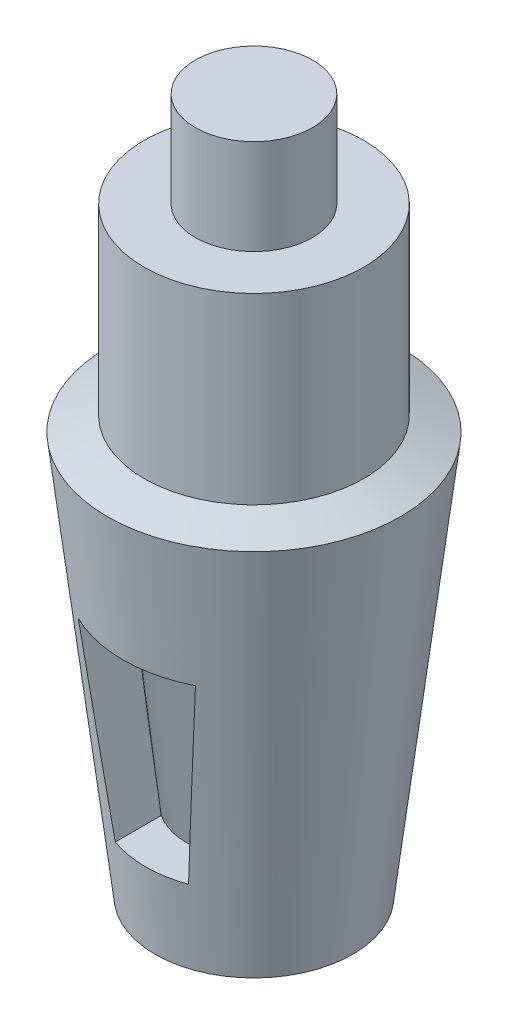
ISO-10303-21;
HEADER;
FILE_DESCRIPTION(('STEP AP214'),'2;1');
FILE_NAME('part.step','',(''),(''),'','','');
FILE_SCHEMA(('AUTOMOTIVE_DESIGN { 1 0 10303 214 1 1 1 1 }'));
ENDSEC;
DATA;
#1=APPLICATION_CONTEXT('core data for automotive mechanical design processes');
#2=APPLICATION_PROTOCOL_DEFINITION('international standard','automotive_design',2000,#1);
#3=PRODUCT_CONTEXT('',#1,'mechanical');
#4=PRODUCT('Part','Part','',(#3));
#5=PRODUCT_RELATED_PRODUCT_CATEGORY('part','',(#4));
#6=PRODUCT_DEFINITION_FORMATION('','',#4);
#7=PRODUCT_DEFINITION_CONTEXT('part definition',#1,'design');
#8=PRODUCT_DEFINITION('design','',#6,#7);
#9=PRODUCT_DEFINITION_SHAPE('','',#8);
#10=(LENGTH_UNIT() NAMED_UNIT(*) SI_UNIT(.MILLI.,.METRE.));
#11=(NAMED_UNIT(*) PLANE_ANGLE_UNIT() SI_UNIT($,.RADIAN.));
#12=(NAMED_UNIT(*) SI_UNIT($,.STERADIAN.) SOLID_ANGLE_UNIT());
#13=UNCERTAINTY_MEASURE_WITH_UNIT(LENGTH_MEASURE(1.E-05),#10,'distance_accuracy_value','');
#14=(GEOMETRIC_REPRESENTATION_CONTEXT(3) GLOBAL_UNCERTAINTY_ASSIGNED_CONTEXT((#13)) GLOBAL_UNIT_ASSIGNED_CONTEXT((#10,
#11,#12)) REPRESENTATION_CONTEXT('',''));
#15=CARTESIAN_POINT('',(0.,0.,0.));
#16=DIRECTION('',(0.,0.,1.));
#17=DIRECTION('',(1.,0.,0.));
#18=AXIS2_PLACEMENT_3D('',#15,#16,#17);
#19=CARTESIAN_POINT('',(0.,86.5188696797201,0.));
#20=DIRECTION('',(0.,1.,0.));
#21=DIRECTION('',(0.,0.,1.));
#22=AXIS2_PLACEMENT_3D('',#19,#20,#21);
#23=TOROIDAL_SURFACE('',#22,20.,5.);
#24=CARTESIAN_POINT('',(0.,86.,0.));
#25=DIRECTION('',(0.,1.,0.));
#26=DIRECTION('',(0.,0.,1.));
#27=AXIS2_PLACEMENT_3D('',#24,#25,#26);
#28=CIRCLE('',#27,24.9730045501153);
#29=CARTESIAN_POINT('',(0.,86.,24.9730045501153));
#30=VERTEX_POINT('',#29);
#31=EDGE_CURVE('E159',#30,#30,#28,.T.);
#32=ORIENTED_EDGE('',*,*,#31,.F.);
#33=EDGE_LOOP('',(#32));
#34=FACE_BOUND('',#33,.T.);
#35=CARTESIAN_POINT('',(0.,91.5188696797201,0.));
#36=DIRECTION('',(0.,1.,0.));
#37=DIRECTION('',(0.,0.,1.));
#38=AXIS2_PLACEMENT_3D('',#35,#36,#37);
#39=CIRCLE('',#38,20.);
#40=CARTESIAN_POINT('',(0.,91.5188696797201,20.));
#41=VERTEX_POINT('',#40);
#42=EDGE_CURVE('E108',#41,#41,#39,.T.);
#43=ORIENTED_EDGE('',*,*,#42,.T.);
#44=EDGE_LOOP('',(#43));
#45=FACE_BOUND('',#44,.T.);
#46=ADVANCED_FACE('F36',(#34,#45),#23,.F.);
#47=CARTESIAN_POINT('',(0.,273.92500733098,0.));
#48=DIRECTION('',(0.,1.,0.));
#49=DIRECTION('',(0.,0.,1.));
#50=AXIS2_PLACEMENT_3D('',#47,#48,#49);
#51=CYLINDRICAL_SURFACE('',#50,20.);
#52=ORIENTED_EDGE('',*,*,#42,.F.);
#53=EDGE_LOOP('',(#52));
#54=FACE_BOUND('',#53,.T.);
#55=CARTESIAN_POINT('',(0.,147.51886967972,0.));
#56=DIRECTION('',(0.,1.,0.));
#57=DIRECTION('',(0.,0.,1.));
#58=AXIS2_PLACEMENT_3D('',#55,#56,#57);
#59=CIRCLE('',#58,20.);
#60=CARTESIAN_POINT('',(0.,147.51886967972,20.));
#61=VERTEX_POINT('',#60);
#62=EDGE_CURVE('E135',#61,#61,#59,.T.);
#63=ORIENTED_EDGE('',*,*,#62,.T.);
#64=EDGE_LOOP('',(#63));
#65=FACE_BOUND('',#64,.T.);
#66=ADVANCED_FACE('F204',(#54,#65),#51,.F.);
#67=CARTESIAN_POINT('',(0.,147.51886967972,0.));
#68=DIRECTION('',(0.,1.,0.));
#69=DIRECTION('',(0.,0.,1.));
#70=AXIS2_PLACEMENT_3D('',#67,#68,#69);
#71=PLANE('',#70);
#72=ORIENTED_EDGE('',*,*,#62,.F.);
#73=EDGE_LOOP('',(#72));
#74=FACE_BOUND('',#73,.T.);
#75=ADVANCED_FACE('F209',(#74),#71,.F.);
#76=CARTESIAN_POINT('',(16.,190.,0.));
#77=DIRECTION('',(0.,-1.,0.));
#78=DIRECTION('',(0.,0.,-1.));
#79=AXIS2_PLACEMENT_3D('',#76,#77,#78);
#80=PLANE('',#79);
#81=CARTESIAN_POINT('',(0.,190.,0.));
#82=DIRECTION('',(0.,1.,0.));
#83=DIRECTION('',(0.,0.,1.));
#84=AXIS2_PLACEMENT_3D('',#81,#82,#83);
#85=CIRCLE('',#84,16.);
#86=CARTESIAN_POINT('',(0.,190.,16.));
#87=VERTEX_POINT('',#86);
#88=EDGE_CURVE('E138',#87,#87,#85,.T.);
#89=ORIENTED_EDGE('',*,*,#88,.T.);
#90=EDGE_LOOP('',(#89));
#91=FACE_BOUND('',#90,.T.);
#92=ADVANCED_FACE('F218',(#91),#80,.F.);
#93=CARTESIAN_POINT('',(0.,273.92500733098,0.));
#94=DIRECTION('',(0.,1.,0.));
#95=DIRECTION('',(0.,0.,1.));
#96=AXIS2_PLACEMENT_3D('',#93,#94,#95);
#97=CYLINDRICAL_SURFACE('',#96,16.);
#98=ORIENTED_EDGE('',*,*,#88,.F.);
#99=EDGE_LOOP('',(#98));
#100=FACE_BOUND('',#99,.T.);
#101=CARTESIAN_POINT('',(0.,164.,0.));
#102=DIRECTION('',(0.,1.,0.));
#103=DIRECTION('',(0.,0.,1.));
#104=AXIS2_PLACEMENT_3D('',#101,#102,#103);
#105=CIRCLE('',#104,16.);
#106=CARTESIAN_POINT('',(0.,164.,16.));
#107=VERTEX_POINT('',#106);
#108=EDGE_CURVE('E141',#107,#107,#105,.T.);
#109=ORIENTED_EDGE('',*,*,#108,.T.);
#110=EDGE_LOOP('',(#109));
#111=FACE_BOUND('',#110,.T.);
#112=ADVANCED_FACE('F223',(#100,#111),#97,.T.);
#113=CARTESIAN_POINT('',(30.,164.,0.));
#114=DIRECTION('',(0.,-1.,0.));
#115=DIRECTION('',(0.,0.,-1.));
#116=AXIS2_PLACEMENT_3D('',#113,#114,#115);
#117=PLANE('',#116);
#118=ORIENTED_EDGE('',*,*,#108,.F.);
#119=EDGE_LOOP('',(#118));
#120=FACE_BOUND('',#119,.T.);
#121=CARTESIAN_POINT('',(0.,164.,0.));
#122=DIRECTION('',(0.,1.,0.));
#123=DIRECTION('',(0.,0.,1.));
#124=AXIS2_PLACEMENT_3D('',#121,#122,#123);
#125=CIRCLE('',#124,30.);
#126=CARTESIAN_POINT('',(0.,164.,30.));
#127=VERTEX_POINT('',#126);
#128=EDGE_CURVE('E144',#127,#127,#125,.T.);
#129=ORIENTED_EDGE('',*,*,#128,.T.);
#130=EDGE_LOOP('',(#129));
#131=FACE_BOUND('',#130,.T.);
#132=ADVANCED_FACE('F229',(#120,#131),#117,.F.);
#133=CARTESIAN_POINT('',(0.,273.92500733098,0.));
#134=DIRECTION('',(0.,1.,0.));
#135=DIRECTION('',(0.,0.,1.));
#136=AXIS2_PLACEMENT_3D('',#133,#134,#135);
#137=CYLINDRICAL_SURFACE('',#136,30.);
#138=ORIENTED_EDGE('',*,*,#128,.F.);
#139=EDGE_LOOP('',(#138));
#140=FACE_BOUND('',#139,.T.);
#141=CARTESIAN_POINT('',(0.,114.,0.));
#142=DIRECTION('',(0.,1.,0.));
#143=DIRECTION('',(0.,0.,1.));
#144=AXIS2_PLACEMENT_3D('',#141,#142,#143);
#145=CIRCLE('',#144,30.);
#146=CARTESIAN_POINT('',(0.,114.,30.));
#147=VERTEX_POINT('',#146);
#148=EDGE_CURVE('E147',#147,#147,#145,.T.);
#149=ORIENTED_EDGE('',*,*,#148,.T.);
#150=EDGE_LOOP('',(#149));
#151=FACE_BOUND('',#150,.T.);
#152=ADVANCED_FACE('F233',(#140,#151),#137,.T.);
#153=CARTESIAN_POINT('',(0.,110.,0.));
#154=DIRECTION('',(0.,-1.,0.));
#155=DIRECTION('',(0.,0.,-1.));
#156=AXIS2_PLACEMENT_3D('',#153,#154,#155);
#157=CONICAL_SURFACE('',#156,40.,1.19028994968253);
#158=ORIENTED_EDGE('',*,*,#148,.F.);
#159=EDGE_LOOP('',(#158));
#160=FACE_BOUND('',#159,.T.);
#161=CARTESIAN_POINT('',(0.,110.,0.));
#162=DIRECTION('',(0.,1.,0.));
#163=DIRECTION('',(0.,0.,1.));
#164=AXIS2_PLACEMENT_3D('',#161,#162,#163);
#165=CIRCLE('',#164,40.);
#166=CARTESIAN_POINT('',(0.,110.,40.));
#167=VERTEX_POINT('',#166);
#168=EDGE_CURVE('E150',#167,#167,#165,.T.);
#169=ORIENTED_EDGE('',*,*,#168,.T.);
#170=EDGE_LOOP('',(#169));
#171=FACE_BOUND('',#170,.T.);
#172=ADVANCED_FACE('F199',(#160,#171),#157,.T.);
#173=CARTESIAN_POINT('',(0.,0.,0.));
#174=DIRECTION('',(0.,1.,0.));
#175=DIRECTION('',(0.,0.,1.));
#176=AXIS2_PLACEMENT_3D('',#173,#174,#175);
#177=CONICAL_SURFACE('',#176,27.,0.117636170678295);
#178=CARTESIAN_POINT('',(0.,22.,0.));
#179=DIRECTION('',(0.,-1.,0.));
#180=DIRECTION('',(0.,0.,-1.));
#181=AXIS2_PLACEMENT_3D('',#178,#179,#180);
#182=CIRCLE('',#181,29.6);
#183=CARTESIAN_POINT('',(9.99999999999996,22.,27.8596482389854));
#184=VERTEX_POINT('',#183);
#185=CARTESIAN_POINT('',(-10.,22.,27.8596482389854));
#186=VERTEX_POINT('',#185);
#187=EDGE_CURVE('E407',#184,#186,#182,.T.);
#188=ORIENTED_EDGE('',*,*,#187,.T.);
#189=CARTESIAN_POINT('',(-9.99997692307696,21.9998,27.8596314093665));
#190=CARTESIAN_POINT('',(-10.4997770070142,26.3314007274562,28.2240884464429));
#191=CARTESIAN_POINT('',(-10.9996377151156,30.6635268643353,28.5821757935411));
#192=CARTESIAN_POINT('',(-11.9994631916428,39.3286809942376,29.286807502451));
#193=CARTESIAN_POINT('',(-12.4994279594558,43.6617089819501,29.6333519304021));
#194=CARTESIAN_POINT('',(-13.4994494117308,52.3285615683331,30.3160978781436));
#195=CARTESIAN_POINT('',(-13.9995060960659,56.6623861659046,30.6522994120936));
#196=CARTESIAN_POINT('',(-14.9997043162846,65.3307707411336,31.3152948276187));
#197=CARTESIAN_POINT('',(-15.4998458526376,69.6653307228595,31.6420886553154));
#198=CARTESIAN_POINT('',(-16.0000230769231,74.0002,31.9646440928844));
#199=B_SPLINE_CURVE_WITH_KNOTS('',3,(#189,#190,#191,#192,#193,#194,#195,#196,#197,#198),
.UNSPECIFIED.,.F.,.F.,(4,2,2,2,4),(0.,13.1266252435605,26.25317526043,39.3797073059777,
52.5063145129759),.UNSPECIFIED.);
#200=CARTESIAN_POINT('',(-16.,74.,31.9646292120081));
#201=VERTEX_POINT('',#200);
#202=EDGE_CURVE('E171',#186,#201,#199,.T.);
#203=ORIENTED_EDGE('',*,*,#202,.T.);
#204=CARTESIAN_POINT('',(0.,74.,0.));
#205=DIRECTION('',(0.,1.,0.));
#206=DIRECTION('',(0.,0.,1.));
#207=AXIS2_PLACEMENT_3D('',#204,#205,#206);
#208=CIRCLE('',#207,35.7454545454546);
#209=CARTESIAN_POINT('',(16.,74.,31.964629212008));
#210=VERTEX_POINT('',#209);
#211=EDGE_CURVE('E433',#201,#210,#208,.T.);
#212=ORIENTED_EDGE('',*,*,#211,.T.);
#213=CARTESIAN_POINT('',(16.0000230769231,74.0002,31.9646440928844));
#214=CARTESIAN_POINT('',(15.4998458526376,69.6653307228595,31.6420886553154));
#215=CARTESIAN_POINT('',(14.9997043162846,65.3307707411336,31.3152948276187));
#216=CARTESIAN_POINT('',(13.9995060960659,56.6623861659046,30.6522994120936));
#217=CARTESIAN_POINT('',(13.4994494117307,52.3285615683331,30.3160978781436));
#218=CARTESIAN_POINT('',(12.4994279594558,43.6617089819502,29.6333519304022));
#219=CARTESIAN_POINT('',(11.9994631916428,39.3286809942376,29.2868075024511));
#220=CARTESIAN_POINT('',(10.9996377151156,30.6635268643353,28.5821757935411));
#221=CARTESIAN_POINT('',(10.4997770070141,26.3314007274562,28.2240884464429));
#222=CARTESIAN_POINT('',(9.99997692307688,21.9998,27.8596314093666));
#223=B_SPLINE_CURVE_WITH_KNOTS('',3,(#213,#214,#215,#216,#217,#218,#219,#220,#221,#222),
.UNSPECIFIED.,.F.,.F.,(4,2,2,2,4),(0.,13.1266072069982,26.2531392525459,39.3796892694154,
52.5063145129759),.UNSPECIFIED.);
#224=EDGE_CURVE('E411',#210,#184,#223,.T.);
#225=ORIENTED_EDGE('',*,*,#224,.T.);
#226=EDGE_LOOP('',(#188,#203,#212,#225));
#227=FACE_BOUND('',#226,.T.);
#228=CARTESIAN_POINT('',(16.,74.,-31.964629212008));
#229=VERTEX_POINT('',#228);
#230=CARTESIAN_POINT('',(-16.,74.,-31.9646292120081));
#231=VERTEX_POINT('',#230);
#232=EDGE_CURVE('E434',#229,#231,#208,.T.);
#233=ORIENTED_EDGE('',*,*,#232,.T.);
#234=CARTESIAN_POINT('',(-16.0000230769231,74.0002,-31.9646440928844));
#235=CARTESIAN_POINT('',(-15.4998458526376,69.6653307228595,-31.6420886553154));
#236=CARTESIAN_POINT('',(-14.9997043162846,65.3307707411336,-31.3152948276187));
#237=CARTESIAN_POINT('',(-13.9995060960659,56.6623861659046,-30.6522994120936));
#238=CARTESIAN_POINT('',(-13.4994494117308,52.3285615683331,-30.3160978781436));
#239=CARTESIAN_POINT('',(-12.4994279594558,43.6617089819502,-29.6333519304021));
#240=CARTESIAN_POINT('',(-11.9994631916428,39.3286809942376,-29.286807502451));
#241=CARTESIAN_POINT('',(-10.9996377151156,30.6635268643353,-28.5821757935411));
#242=CARTESIAN_POINT('',(-10.4997770070142,26.3314007274562,-28.2240884464429));
#243=CARTESIAN_POINT('',(-9.99997692307697,21.9998,-27.8596314093665));
#244=B_SPLINE_CURVE_WITH_KNOTS('',3,(#234,#235,#236,#237,#238,#239,#240,#241,#242,#243),
.UNSPECIFIED.,.F.,.F.,(4,2,2,2,4),(0.,13.1266072069982,26.2531392525459,39.3796892694154,
52.5063145129759),.UNSPECIFIED.);
#245=CARTESIAN_POINT('',(-10.,22.,-27.8596482389854));
#246=VERTEX_POINT('',#245);
#247=EDGE_CURVE('E162',#231,#246,#244,.T.);
#248=ORIENTED_EDGE('',*,*,#247,.T.);
#249=CARTESIAN_POINT('',(9.99999999999996,22.,-27.8596482389854));
#250=VERTEX_POINT('',#249);
#251=EDGE_CURVE('E419',#246,#250,#182,.T.);
#252=ORIENTED_EDGE('',*,*,#251,.T.);
#253=CARTESIAN_POINT('',(9.99997692307688,21.9998,-27.8596314093666));
#254=CARTESIAN_POINT('',(10.4997770070141,26.3314007274562,-28.2240884464429));
#255=CARTESIAN_POINT('',(10.9996377151156,30.6635268643353,-28.5821757935411));
#256=CARTESIAN_POINT('',(11.9994631916428,39.3286809942376,-29.2868075024511));
#257=CARTESIAN_POINT('',(12.4994279594558,43.6617089819502,-29.6333519304022));
#258=CARTESIAN_POINT('',(13.4994494117307,52.3285615683331,-30.3160978781436));
#259=CARTESIAN_POINT('',(13.9995060960659,56.6623861659046,-30.6522994120936));
#260=CARTESIAN_POINT('',(14.9997043162846,65.3307707411336,-31.3152948276187));
#261=CARTESIAN_POINT('',(15.4998458526376,69.6653307228595,-31.6420886553154));
#262=CARTESIAN_POINT('',(16.0000230769231,74.0002,-31.9646440928844));
#263=B_SPLINE_CURVE_WITH_KNOTS('',3,(#253,#254,#255,#256,#257,#258,#259,#260,#261,#262),
.UNSPECIFIED.,.F.,.F.,(4,2,2,2,4),(0.,13.1266252435605,26.25317526043,39.3797073059778,
52.5063145129759),.UNSPECIFIED.);
#264=EDGE_CURVE('E116',#250,#229,#263,.T.);
#265=ORIENTED_EDGE('',*,*,#264,.T.);
#266=EDGE_LOOP('',(#233,#248,#252,#265));
#267=FACE_BOUND('',#266,.T.);
#268=ORIENTED_EDGE('',*,*,#168,.F.);
#269=EDGE_LOOP('',(#268));
#270=FACE_BOUND('',#269,.T.);
#271=CARTESIAN_POINT('',(0.,0.,0.));
#272=DIRECTION('',(0.,1.,0.));
#273=DIRECTION('',(0.,0.,1.));
#274=AXIS2_PLACEMENT_3D('',#271,#272,#273);
#275=CIRCLE('',#274,27.);
#276=CARTESIAN_POINT('',(0.,0.,27.));
#277=VERTEX_POINT('',#276);
#278=EDGE_CURVE('E153',#277,#277,#275,.T.);
#279=ORIENTED_EDGE('',*,*,#278,.T.);
#280=EDGE_LOOP('',(#279));
#281=FACE_BOUND('',#280,.T.);
#282=ADVANCED_FACE('F177',(#227,#267,#270,#281),#177,.T.);
#283=CARTESIAN_POINT('',(16.,0.,0.));
#284=DIRECTION('',(0.,1.,0.));
#285=DIRECTION('',(0.,0.,1.));
#286=AXIS2_PLACEMENT_3D('',#283,#284,#285);
#287=PLANE('',#286);
#288=ORIENTED_EDGE('',*,*,#278,.F.);
#289=EDGE_LOOP('',(#288));
#290=FACE_BOUND('',#289,.T.);
#291=CARTESIAN_POINT('',(0.,0.,0.));
#292=DIRECTION('',(0.,1.,0.));
#293=DIRECTION('',(0.,0.,1.));
#294=AXIS2_PLACEMENT_3D('',#291,#292,#293);
#295=CIRCLE('',#294,16.);
#296=CARTESIAN_POINT('',(0.,0.,16.));
#297=VERTEX_POINT('',#296);
#298=EDGE_CURVE('E156',#297,#297,#295,.T.);
#299=ORIENTED_EDGE('',*,*,#298,.T.);
#300=EDGE_LOOP('',(#299));
#301=FACE_BOUND('',#300,.T.);
#302=ADVANCED_FACE('F193',(#290,#301),#287,.F.);
#303=CARTESIAN_POINT('',(0.,86.,0.));
#304=DIRECTION('',(0.,1.,0.));
#305=DIRECTION('',(0.,0.,1.));
#306=AXIS2_PLACEMENT_3D('',#303,#304,#305);
#307=CONICAL_SURFACE('',#306,24.9730045501153,0.103961101822438);
#308=CARTESIAN_POINT('',(0.,74.,0.));
#309=DIRECTION('',(0.,1.,0.));
#310=DIRECTION('',(0.,0.,1.));
#311=AXIS2_PLACEMENT_3D('',#308,#309,#310);
#312=CIRCLE('',#311,23.7209574035876);
#313=CARTESIAN_POINT('',(16.,74.,17.5123904748265));
#314=VERTEX_POINT('',#313);
#315=CARTESIAN_POINT('',(-16.,74.,17.5123904748271));
#316=VERTEX_POINT('',#315);
#317=EDGE_CURVE('E44',#314,#316,#312,.F.);
#318=ORIENTED_EDGE('',*,*,#317,.T.);
#319=CARTESIAN_POINT('',(-45.8914369044074,333.059119838199,0.));
#320=DIRECTION('',(-0.993408935871131,-0.11462410798513,0.));
#321=DIRECTION('',(-0.11462410798513,0.993408935871131,0.));
#322=AXIS2_PLACEMENT_3D('',#319,#320,#321);
#323=ELLIPSE('',#322,442.755696077366,21.6699539910391);
#324=CARTESIAN_POINT('',(-10.,22.,15.3206522220997));
#325=VERTEX_POINT('',#324);
#326=EDGE_CURVE('E11',#316,#325,#323,.F.);
#327=ORIENTED_EDGE('',*,*,#326,.T.);
#328=CARTESIAN_POINT('',(0.,22.,0.));
#329=DIRECTION('',(0.,-1.,0.));
#330=DIRECTION('',(0.,0.,-1.));
#331=AXIS2_PLACEMENT_3D('',#328,#329,#330);
#332=CIRCLE('',#331,18.2954197686341);
#333=CARTESIAN_POINT('',(9.99999999999996,22.,15.3206522220997));
#334=VERTEX_POINT('',#333);
#335=EDGE_CURVE('E110',#325,#334,#332,.F.);
#336=ORIENTED_EDGE('',*,*,#335,.T.);
#337=CARTESIAN_POINT('',(45.891436904401,333.05911983814,0.));
#338=DIRECTION('',(0.993408935871131,-0.114624107985131,0.));
#339=DIRECTION('',(0.114624107985131,0.993408935871131,0.));
#340=AXIS2_PLACEMENT_3D('',#337,#338,#339);
#341=ELLIPSE('',#340,442.755696077299,21.6699539910379);
#342=EDGE_CURVE('E126',#334,#314,#341,.F.);
#343=ORIENTED_EDGE('',*,*,#342,.T.);
#344=EDGE_LOOP('',(#318,#327,#336,#343));
#345=FACE_BOUND('',#344,.T.);
#346=CARTESIAN_POINT('',(9.99999999999996,22.,-15.3206522220997));
#347=VERTEX_POINT('',#346);
#348=CARTESIAN_POINT('',(-10.,22.,-15.3206522220997));
#349=VERTEX_POINT('',#348);
#350=EDGE_CURVE('E99',#347,#349,#332,.F.);
#351=ORIENTED_EDGE('',*,*,#350,.T.);
#352=CARTESIAN_POINT('',(-16.,74.,-17.5123904748271));
#353=VERTEX_POINT('',#352);
#354=EDGE_CURVE('E39',#349,#353,#323,.F.);
#355=ORIENTED_EDGE('',*,*,#354,.T.);
#356=CARTESIAN_POINT('',(16.,74.,-17.5123904748265));
#357=VERTEX_POINT('',#356);
#358=EDGE_CURVE('E124',#353,#357,#312,.F.);
#359=ORIENTED_EDGE('',*,*,#358,.T.);
#360=EDGE_CURVE('E107',#357,#347,#341,.F.);
#361=ORIENTED_EDGE('',*,*,#360,.T.);
#362=EDGE_LOOP('',(#351,#355,#359,#361));
#363=FACE_BOUND('',#362,.T.);
#364=ORIENTED_EDGE('',*,*,#298,.F.);
#365=EDGE_LOOP('',(#364));
#366=FACE_BOUND('',#365,.T.);
#367=ORIENTED_EDGE('',*,*,#31,.T.);
#368=EDGE_LOOP('',(#367));
#369=FACE_BOUND('',#368,.T.);
#370=ADVANCED_FACE('F122',(#345,#363,#366,#369),#307,.F.);
#371=CARTESIAN_POINT('',(-10.,22.,-40.));
#372=DIRECTION('',(0.,-1.,0.));
#373=DIRECTION('',(0.,0.,-1.));
#374=AXIS2_PLACEMENT_3D('',#371,#372,#373);
#375=PLANE('',#374);
#376=DIRECTION('',(0.,0.,1.));
#377=VECTOR('',#376,1.);
#378=CARTESIAN_POINT('',(-10.,22.,-40.));
#379=LINE('',#378,#377);
#380=EDGE_CURVE('E102',#246,#349,#379,.T.);
#381=ORIENTED_EDGE('',*,*,#380,.T.);
#382=ORIENTED_EDGE('',*,*,#350,.F.);
#383=DIRECTION('',(0.,0.,1.));
#384=VECTOR('',#383,1.);
#385=CARTESIAN_POINT('',(9.99999999999996,22.,-40.));
#386=LINE('',#385,#384);
#387=EDGE_CURVE('E59',#250,#347,#386,.T.);
#388=ORIENTED_EDGE('',*,*,#387,.F.);
#389=ORIENTED_EDGE('',*,*,#251,.F.);
#390=EDGE_LOOP('',(#381,#382,#388,#389));
#391=FACE_BOUND('',#390,.T.);
#392=ADVANCED_FACE('F100',(#391),#375,.F.);
#393=CARTESIAN_POINT('',(9.99999999999996,22.,-40.));
#394=DIRECTION('',(0.993408935871131,-0.114624107985131,0.));
#395=DIRECTION('',(0.114624107985131,0.993408935871131,0.));
#396=AXIS2_PLACEMENT_3D('',#393,#394,#395);
#397=PLANE('',#396);
#398=ORIENTED_EDGE('',*,*,#387,.T.);
#399=ORIENTED_EDGE('',*,*,#360,.F.);
#400=DIRECTION('',(0.,0.,1.));
#401=VECTOR('',#400,1.);
#402=CARTESIAN_POINT('',(16.,74.,-40.));
#403=LINE('',#402,#401);
#404=EDGE_CURVE('E413',#229,#357,#403,.T.);
#405=ORIENTED_EDGE('',*,*,#404,.F.);
#406=ORIENTED_EDGE('',*,*,#264,.F.);
#407=EDGE_LOOP('',(#398,#399,#405,#406));
#408=FACE_BOUND('',#407,.T.);
#409=ADVANCED_FACE('F112',(#408),#397,.F.);
#410=CARTESIAN_POINT('',(16.,74.,-40.));
#411=DIRECTION('',(0.,1.,0.));
#412=DIRECTION('',(0.,0.,1.));
#413=AXIS2_PLACEMENT_3D('',#410,#411,#412);
#414=PLANE('',#413);
#415=ORIENTED_EDGE('',*,*,#404,.T.);
#416=ORIENTED_EDGE('',*,*,#358,.F.);
#417=DIRECTION('',(0.,0.,1.));
#418=VECTOR('',#417,1.);
#419=CARTESIAN_POINT('',(-16.,74.,-40.));
#420=LINE('',#419,#418);
#421=EDGE_CURVE('E421',#231,#353,#420,.T.);
#422=ORIENTED_EDGE('',*,*,#421,.F.);
#423=ORIENTED_EDGE('',*,*,#232,.F.);
#424=EDGE_LOOP('',(#415,#416,#422,#423));
#425=FACE_BOUND('',#424,.T.);
#426=ADVANCED_FACE('F187',(#425),#414,.F.);
#427=CARTESIAN_POINT('',(-16.,74.,-40.));
#428=DIRECTION('',(-0.993408935871131,-0.11462410798513,0.));
#429=DIRECTION('',(0.11462410798513,-0.993408935871131,0.));
#430=AXIS2_PLACEMENT_3D('',#427,#428,#429);
#431=PLANE('',#430);
#432=ORIENTED_EDGE('',*,*,#421,.T.);
#433=ORIENTED_EDGE('',*,*,#354,.F.);
#434=ORIENTED_EDGE('',*,*,#380,.F.);
#435=ORIENTED_EDGE('',*,*,#247,.F.);
#436=EDGE_LOOP('',(#432,#433,#434,#435));
#437=FACE_BOUND('',#436,.T.);
#438=ADVANCED_FACE('F181',(#437),#431,.F.);
#439=EDGE_CURVE('E51',#325,#186,#379,.T.);
#440=ORIENTED_EDGE('',*,*,#439,.F.);
#441=ORIENTED_EDGE('',*,*,#326,.F.);
#442=EDGE_CURVE('E415',#316,#201,#420,.T.);
#443=ORIENTED_EDGE('',*,*,#442,.T.);
#444=ORIENTED_EDGE('',*,*,#202,.F.);
#445=EDGE_LOOP('',(#440,#441,#443,#444));
#446=FACE_BOUND('',#445,.T.);
#447=ADVANCED_FACE('F186',(#446),#431,.F.);
#448=ORIENTED_EDGE('',*,*,#442,.F.);
#449=ORIENTED_EDGE('',*,*,#317,.F.);
#450=EDGE_CURVE('E118',#314,#210,#403,.T.);
#451=ORIENTED_EDGE('',*,*,#450,.T.);
#452=ORIENTED_EDGE('',*,*,#211,.F.);
#453=EDGE_LOOP('',(#448,#449,#451,#452));
#454=FACE_BOUND('',#453,.T.);
#455=ADVANCED_FACE('F291',(#454),#414,.F.);
#456=ORIENTED_EDGE('',*,*,#450,.F.);
#457=ORIENTED_EDGE('',*,*,#342,.F.);
#458=EDGE_CURVE('E119',#334,#184,#386,.T.);
#459=ORIENTED_EDGE('',*,*,#458,.T.);
#460=ORIENTED_EDGE('',*,*,#224,.F.);
#461=EDGE_LOOP('',(#456,#457,#459,#460));
#462=FACE_BOUND('',#461,.T.);
#463=ADVANCED_FACE('F280',(#462),#397,.F.);
#464=ORIENTED_EDGE('',*,*,#458,.F.);
#465=ORIENTED_EDGE('',*,*,#335,.F.);
#466=ORIENTED_EDGE('',*,*,#439,.T.);
#467=ORIENTED_EDGE('',*,*,#187,.F.);
#468=EDGE_LOOP('',(#464,#465,#466,#467));
#469=FACE_BOUND('',#468,.T.);
#470=ADVANCED_FACE('F189',(#469),#375,.F.);
#471=CLOSED_SHELL('',(#46,#66,#75,#92,#112,#132,#152,#172,#282,#302,#370,#392,#409,#426,#438,
#447,#455,#463,#470));
#472=MANIFOLD_SOLID_BREP('B2',#471);
#473=ADVANCED_BREP_SHAPE_REPRESENTATION('',(#18,#472),#14);
#474=SHAPE_DEFINITION_REPRESENTATION(#9,#473);
ENDSEC;
END-ISO-10303-21;
